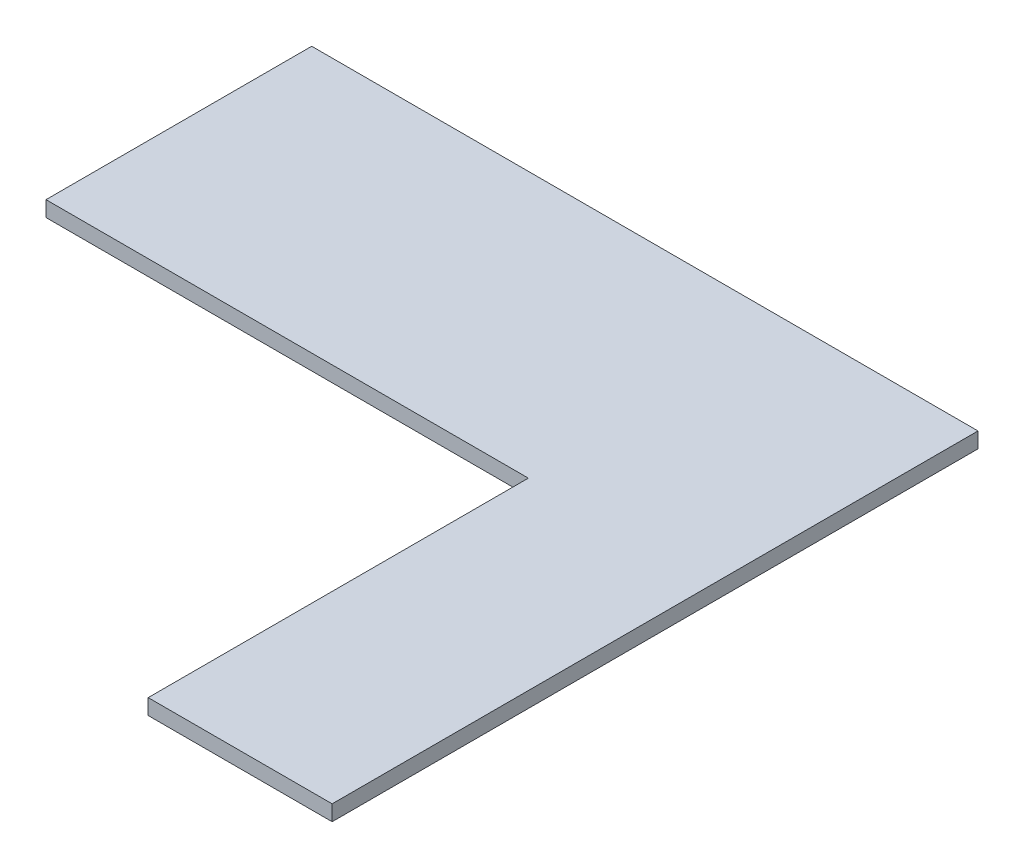
ISO-10303-21;
HEADER;
FILE_DESCRIPTION(('STEP AP214'),'2;1');
FILE_NAME('part.step','',(''),(''),'','','');
FILE_SCHEMA(('AUTOMOTIVE_DESIGN { 1 0 10303 214 1 1 1 1 }'));
ENDSEC;
DATA;
#1=APPLICATION_CONTEXT('core data for automotive mechanical design processes');
#2=APPLICATION_PROTOCOL_DEFINITION('international standard','automotive_design',2000,#1);
#3=PRODUCT_CONTEXT('',#1,'mechanical');
#4=PRODUCT('Part','Part','',(#3));
#5=PRODUCT_RELATED_PRODUCT_CATEGORY('part','',(#4));
#6=PRODUCT_DEFINITION_FORMATION('','',#4);
#7=PRODUCT_DEFINITION_CONTEXT('part definition',#1,'design');
#8=PRODUCT_DEFINITION('design','',#6,#7);
#9=PRODUCT_DEFINITION_SHAPE('','',#8);
#10=(LENGTH_UNIT() NAMED_UNIT(*) SI_UNIT(.MILLI.,.METRE.));
#11=(NAMED_UNIT(*) PLANE_ANGLE_UNIT() SI_UNIT($,.RADIAN.));
#12=(NAMED_UNIT(*) SI_UNIT($,.STERADIAN.) SOLID_ANGLE_UNIT());
#13=UNCERTAINTY_MEASURE_WITH_UNIT(LENGTH_MEASURE(1.E-05),#10,'distance_accuracy_value','');
#14=(GEOMETRIC_REPRESENTATION_CONTEXT(3) GLOBAL_UNCERTAINTY_ASSIGNED_CONTEXT((#13)) GLOBAL_UNIT_ASSIGNED_CONTEXT((#10,
#11,#12)) REPRESENTATION_CONTEXT('',''));
#15=CARTESIAN_POINT('',(0.,0.,0.));
#16=DIRECTION('',(0.,0.,1.));
#17=DIRECTION('',(1.,0.,0.));
#18=AXIS2_PLACEMENT_3D('',#15,#16,#17);
#19=CARTESIAN_POINT('',(1180.,38.,0.));
#20=DIRECTION('',(0.,0.,-1.));
#21=DIRECTION('',(-1.,0.,0.));
#22=AXIS2_PLACEMENT_3D('',#19,#20,#21);
#23=PLANE('',#22);
#24=DIRECTION('',(1.,0.,0.));
#25=VECTOR('',#24,1.);
#26=CARTESIAN_POINT('',(1180.,0.,0.));
#27=LINE('',#26,#25);
#28=CARTESIAN_POINT('',(0.,0.,0.));
#29=VERTEX_POINT('',#28);
#30=CARTESIAN_POINT('',(1180.,0.,0.));
#31=VERTEX_POINT('',#30);
#32=EDGE_CURVE('E128',#29,#31,#27,.T.);
#33=ORIENTED_EDGE('',*,*,#32,.T.);
#34=DIRECTION('',(0.,-1.,0.));
#35=VECTOR('',#34,1.);
#36=CARTESIAN_POINT('',(1180.,38.,0.));
#37=LINE('',#36,#35);
#38=CARTESIAN_POINT('',(1180.,38.,0.));
#39=VERTEX_POINT('',#38);
#40=EDGE_CURVE('E11',#39,#31,#37,.T.);
#41=ORIENTED_EDGE('',*,*,#40,.F.);
#42=DIRECTION('',(1.,0.,0.));
#43=VECTOR('',#42,1.);
#44=CARTESIAN_POINT('',(1180.,38.,0.));
#45=LINE('',#44,#43);
#46=CARTESIAN_POINT('',(0.,38.,0.));
#47=VERTEX_POINT('',#46);
#48=EDGE_CURVE('E144',#47,#39,#45,.T.);
#49=ORIENTED_EDGE('',*,*,#48,.F.);
#50=DIRECTION('',(0.,-1.,0.));
#51=VECTOR('',#50,1.);
#52=CARTESIAN_POINT('',(0.,38.,0.));
#53=LINE('',#52,#51);
#54=EDGE_CURVE('E124',#47,#29,#53,.T.);
#55=ORIENTED_EDGE('',*,*,#54,.T.);
#56=EDGE_LOOP('',(#33,#41,#49,#55));
#57=FACE_BOUND('',#56,.T.);
#58=ADVANCED_FACE('F39',(#57),#23,.F.);
#59=CARTESIAN_POINT('',(1180.,38.,929.999999999998));
#60=DIRECTION('',(1.,0.,0.));
#61=DIRECTION('',(0.,0.,-1.));
#62=AXIS2_PLACEMENT_3D('',#59,#60,#61);
#63=PLANE('',#62);
#64=DIRECTION('',(0.,0.,1.));
#65=VECTOR('',#64,1.);
#66=CARTESIAN_POINT('',(1180.,0.,929.999999999998));
#67=LINE('',#66,#65);
#68=CARTESIAN_POINT('',(1180.,0.,929.999999999998));
#69=VERTEX_POINT('',#68);
#70=EDGE_CURVE('E132',#31,#69,#67,.T.);
#71=ORIENTED_EDGE('',*,*,#70,.T.);
#72=DIRECTION('',(0.,-1.,0.));
#73=VECTOR('',#72,1.);
#74=CARTESIAN_POINT('',(1180.,38.,929.999999999998));
#75=LINE('',#74,#73);
#76=CARTESIAN_POINT('',(1180.,38.,929.999999999998));
#77=VERTEX_POINT('',#76);
#78=EDGE_CURVE('E48',#77,#69,#75,.T.);
#79=ORIENTED_EDGE('',*,*,#78,.F.);
#80=DIRECTION('',(0.,0.,1.));
#81=VECTOR('',#80,1.);
#82=CARTESIAN_POINT('',(1180.,38.,929.999999999998));
#83=LINE('',#82,#81);
#84=EDGE_CURVE('E93',#39,#77,#83,.T.);
#85=ORIENTED_EDGE('',*,*,#84,.F.);
#86=ORIENTED_EDGE('',*,*,#40,.T.);
#87=EDGE_LOOP('',(#71,#79,#85,#86));
#88=FACE_BOUND('',#87,.T.);
#89=ADVANCED_FACE('F172',(#88),#63,.F.);
#90=CARTESIAN_POINT('',(1630.,38.,929.999999999998));
#91=DIRECTION('',(0.,0.,-1.));
#92=DIRECTION('',(-1.,0.,0.));
#93=AXIS2_PLACEMENT_3D('',#90,#91,#92);
#94=PLANE('',#93);
#95=DIRECTION('',(1.,0.,0.));
#96=VECTOR('',#95,1.);
#97=CARTESIAN_POINT('',(1630.,0.,929.999999999998));
#98=LINE('',#97,#96);
#99=CARTESIAN_POINT('',(1630.,0.,929.999999999998));
#100=VERTEX_POINT('',#99);
#101=EDGE_CURVE('E135',#69,#100,#98,.T.);
#102=ORIENTED_EDGE('',*,*,#101,.T.);
#103=DIRECTION('',(0.,-1.,0.));
#104=VECTOR('',#103,1.);
#105=CARTESIAN_POINT('',(1630.,38.,929.999999999998));
#106=LINE('',#105,#104);
#107=CARTESIAN_POINT('',(1630.,38.,929.999999999998));
#108=VERTEX_POINT('',#107);
#109=EDGE_CURVE('E117',#108,#100,#106,.T.);
#110=ORIENTED_EDGE('',*,*,#109,.F.);
#111=DIRECTION('',(1.,0.,0.));
#112=VECTOR('',#111,1.);
#113=CARTESIAN_POINT('',(1630.,38.,929.999999999998));
#114=LINE('',#113,#112);
#115=EDGE_CURVE('E106',#77,#108,#114,.T.);
#116=ORIENTED_EDGE('',*,*,#115,.F.);
#117=ORIENTED_EDGE('',*,*,#78,.T.);
#118=EDGE_LOOP('',(#102,#110,#116,#117));
#119=FACE_BOUND('',#118,.T.);
#120=ADVANCED_FACE('F154',(#119),#94,.F.);
#121=CARTESIAN_POINT('',(1630.,38.,-650.));
#122=DIRECTION('',(-1.,0.,0.));
#123=DIRECTION('',(0.,0.,1.));
#124=AXIS2_PLACEMENT_3D('',#121,#122,#123);
#125=PLANE('',#124);
#126=DIRECTION('',(0.,0.,-1.));
#127=VECTOR('',#126,1.);
#128=CARTESIAN_POINT('',(1630.,0.,-650.));
#129=LINE('',#128,#127);
#130=CARTESIAN_POINT('',(1630.,0.,-650.));
#131=VERTEX_POINT('',#130);
#132=EDGE_CURVE('E115',#100,#131,#129,.T.);
#133=ORIENTED_EDGE('',*,*,#132,.T.);
#134=DIRECTION('',(0.,-1.,0.));
#135=VECTOR('',#134,1.);
#136=CARTESIAN_POINT('',(1630.,38.,-650.));
#137=LINE('',#136,#135);
#138=CARTESIAN_POINT('',(1630.,38.,-650.));
#139=VERTEX_POINT('',#138);
#140=EDGE_CURVE('E112',#139,#131,#137,.T.);
#141=ORIENTED_EDGE('',*,*,#140,.F.);
#142=DIRECTION('',(0.,0.,-1.));
#143=VECTOR('',#142,1.);
#144=CARTESIAN_POINT('',(1630.,38.,-650.));
#145=LINE('',#144,#143);
#146=EDGE_CURVE('E100',#108,#139,#145,.T.);
#147=ORIENTED_EDGE('',*,*,#146,.F.);
#148=ORIENTED_EDGE('',*,*,#109,.T.);
#149=EDGE_LOOP('',(#133,#141,#147,#148));
#150=FACE_BOUND('',#149,.T.);
#151=ADVANCED_FACE('F113',(#150),#125,.F.);
#152=CARTESIAN_POINT('',(0.,38.,-650.));
#153=DIRECTION('',(0.,0.,1.));
#154=DIRECTION('',(1.,0.,0.));
#155=AXIS2_PLACEMENT_3D('',#152,#153,#154);
#156=PLANE('',#155);
#157=DIRECTION('',(-1.,0.,0.));
#158=VECTOR('',#157,1.);
#159=CARTESIAN_POINT('',(0.,0.,-650.));
#160=LINE('',#159,#158);
#161=CARTESIAN_POINT('',(0.,0.,-650.));
#162=VERTEX_POINT('',#161);
#163=EDGE_CURVE('E79',#131,#162,#160,.T.);
#164=ORIENTED_EDGE('',*,*,#163,.T.);
#165=DIRECTION('',(0.,-1.,0.));
#166=VECTOR('',#165,1.);
#167=CARTESIAN_POINT('',(0.,38.,-650.));
#168=LINE('',#167,#166);
#169=CARTESIAN_POINT('',(0.,38.,-650.));
#170=VERTEX_POINT('',#169);
#171=EDGE_CURVE('E118',#170,#162,#168,.T.);
#172=ORIENTED_EDGE('',*,*,#171,.F.);
#173=DIRECTION('',(-1.,0.,0.));
#174=VECTOR('',#173,1.);
#175=CARTESIAN_POINT('',(0.,38.,-650.));
#176=LINE('',#175,#174);
#177=EDGE_CURVE('E104',#139,#170,#176,.T.);
#178=ORIENTED_EDGE('',*,*,#177,.F.);
#179=ORIENTED_EDGE('',*,*,#140,.T.);
#180=EDGE_LOOP('',(#164,#172,#178,#179));
#181=FACE_BOUND('',#180,.T.);
#182=ADVANCED_FACE('F120',(#181),#156,.F.);
#183=CARTESIAN_POINT('',(0.,38.,0.));
#184=DIRECTION('',(1.,0.,0.));
#185=DIRECTION('',(0.,0.,-1.));
#186=AXIS2_PLACEMENT_3D('',#183,#184,#185);
#187=PLANE('',#186);
#188=DIRECTION('',(0.,0.,1.));
#189=VECTOR('',#188,1.);
#190=CARTESIAN_POINT('',(0.,0.,0.));
#191=LINE('',#190,#189);
#192=EDGE_CURVE('E85',#162,#29,#191,.T.);
#193=ORIENTED_EDGE('',*,*,#192,.T.);
#194=ORIENTED_EDGE('',*,*,#54,.F.);
#195=DIRECTION('',(0.,0.,1.));
#196=VECTOR('',#195,1.);
#197=CARTESIAN_POINT('',(0.,38.,0.));
#198=LINE('',#197,#196);
#199=EDGE_CURVE('E56',#170,#47,#198,.T.);
#200=ORIENTED_EDGE('',*,*,#199,.F.);
#201=ORIENTED_EDGE('',*,*,#171,.T.);
#202=EDGE_LOOP('',(#193,#194,#200,#201));
#203=FACE_BOUND('',#202,.T.);
#204=ADVANCED_FACE('F161',(#203),#187,.F.);
#205=CARTESIAN_POINT('',(0.,38.,0.));
#206=DIRECTION('',(0.,-1.,0.));
#207=DIRECTION('',(0.,0.,-1.));
#208=AXIS2_PLACEMENT_3D('',#205,#206,#207);
#209=PLANE('',#208);
#210=ORIENTED_EDGE('',*,*,#48,.T.);
#211=ORIENTED_EDGE('',*,*,#84,.T.);
#212=ORIENTED_EDGE('',*,*,#115,.T.);
#213=ORIENTED_EDGE('',*,*,#146,.T.);
#214=ORIENTED_EDGE('',*,*,#177,.T.);
#215=ORIENTED_EDGE('',*,*,#199,.T.);
#216=EDGE_LOOP('',(#210,#211,#212,#213,#214,#215));
#217=FACE_BOUND('',#216,.T.);
#218=ADVANCED_FACE('F102',(#217),#209,.F.);
#219=CARTESIAN_POINT('',(0.,0.,0.));
#220=DIRECTION('',(0.,-1.,0.));
#221=DIRECTION('',(0.,0.,-1.));
#222=AXIS2_PLACEMENT_3D('',#219,#220,#221);
#223=PLANE('',#222);
#224=ORIENTED_EDGE('',*,*,#32,.F.);
#225=ORIENTED_EDGE('',*,*,#192,.F.);
#226=ORIENTED_EDGE('',*,*,#163,.F.);
#227=ORIENTED_EDGE('',*,*,#132,.F.);
#228=ORIENTED_EDGE('',*,*,#101,.F.);
#229=ORIENTED_EDGE('',*,*,#70,.F.);
#230=EDGE_LOOP('',(#224,#225,#226,#227,#228,#229));
#231=FACE_BOUND('',#230,.T.);
#232=ADVANCED_FACE('F157',(#231),#223,.T.);
#233=CLOSED_SHELL('',(#58,#89,#120,#151,#182,#204,#218,#232));
#234=MANIFOLD_SOLID_BREP('B2',#233);
#235=ADVANCED_BREP_SHAPE_REPRESENTATION('',(#18,#234),#14);
#236=SHAPE_DEFINITION_REPRESENTATION(#9,#235);
ENDSEC;
END-ISO-10303-21;
